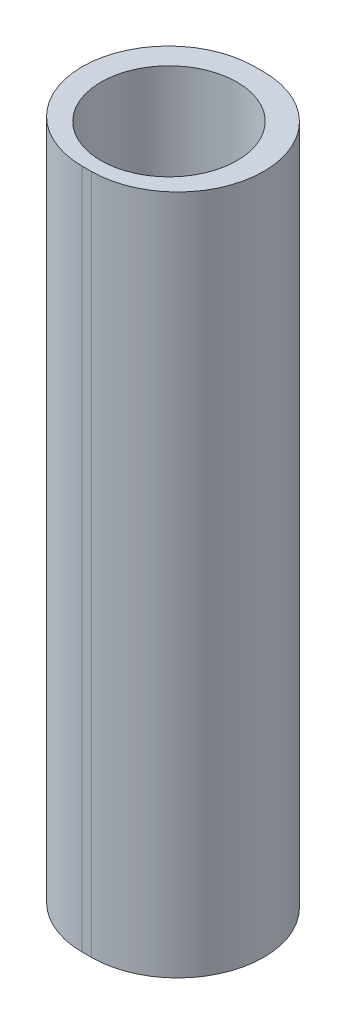
ISO-10303-21;
HEADER;
FILE_DESCRIPTION(('STEP AP214'),'2;1');
FILE_NAME('part.step','',(''),(''),'','','');
FILE_SCHEMA(('AUTOMOTIVE_DESIGN { 1 0 10303 214 1 1 1 1 }'));
ENDSEC;
DATA;
#1=APPLICATION_CONTEXT('core data for automotive mechanical design processes');
#2=APPLICATION_PROTOCOL_DEFINITION('international standard','automotive_design',2000,#1);
#3=PRODUCT_CONTEXT('',#1,'mechanical');
#4=PRODUCT('Part','Part','',(#3));
#5=PRODUCT_RELATED_PRODUCT_CATEGORY('part','',(#4));
#6=PRODUCT_DEFINITION_FORMATION('','',#4);
#7=PRODUCT_DEFINITION_CONTEXT('part definition',#1,'design');
#8=PRODUCT_DEFINITION('design','',#6,#7);
#9=PRODUCT_DEFINITION_SHAPE('','',#8);
#10=(LENGTH_UNIT() NAMED_UNIT(*) SI_UNIT(.MILLI.,.METRE.));
#11=(NAMED_UNIT(*) PLANE_ANGLE_UNIT() SI_UNIT($,.RADIAN.));
#12=(NAMED_UNIT(*) SI_UNIT($,.STERADIAN.) SOLID_ANGLE_UNIT());
#13=UNCERTAINTY_MEASURE_WITH_UNIT(LENGTH_MEASURE(1.E-05),#10,'distance_accuracy_value','');
#14=(GEOMETRIC_REPRESENTATION_CONTEXT(3) GLOBAL_UNCERTAINTY_ASSIGNED_CONTEXT((#13)) GLOBAL_UNIT_ASSIGNED_CONTEXT((#10,
#11,#12)) REPRESENTATION_CONTEXT('',''));
#15=CARTESIAN_POINT('',(0.,0.,0.));
#16=DIRECTION('',(0.,0.,1.));
#17=DIRECTION('',(1.,0.,0.));
#18=AXIS2_PLACEMENT_3D('',#15,#16,#17);
#19=CARTESIAN_POINT('',(-0.1,15.,-1.9));
#20=DIRECTION('',(0.,-1.,0.));
#21=DIRECTION('',(0.,0.,-1.));
#22=AXIS2_PLACEMENT_3D('',#19,#20,#21);
#23=CYLINDRICAL_SURFACE('',#22,1.9);
#24=DIRECTION('',(0.,-1.,0.));
#25=VECTOR('',#24,1.);
#26=CARTESIAN_POINT('',(-0.1,0.,0.));
#27=LINE('',#26,#25);
#28=CARTESIAN_POINT('',(-0.1,15.,0.));
#29=VERTEX_POINT('',#28);
#30=CARTESIAN_POINT('',(-0.1,0.,0.));
#31=VERTEX_POINT('',#30);
#32=EDGE_CURVE('E102',#29,#31,#27,.T.);
#33=ORIENTED_EDGE('',*,*,#32,.F.);
#34=CARTESIAN_POINT('',(-0.1,15.,-1.9));
#35=DIRECTION('',(0.,-1.,0.));
#36=DIRECTION('',(0.,0.,-1.));
#37=AXIS2_PLACEMENT_3D('',#34,#35,#36);
#38=CIRCLE('',#37,1.9);
#39=CARTESIAN_POINT('',(-0.1,15.,-3.8));
#40=VERTEX_POINT('',#39);
#41=EDGE_CURVE('E50',#40,#29,#38,.F.);
#42=ORIENTED_EDGE('',*,*,#41,.F.);
#43=DIRECTION('',(0.,-1.,0.));
#44=VECTOR('',#43,1.);
#45=CARTESIAN_POINT('',(-0.1,0.,-3.8));
#46=LINE('',#45,#44);
#47=CARTESIAN_POINT('',(-0.1,0.,-3.8));
#48=VERTEX_POINT('',#47);
#49=EDGE_CURVE('E116',#48,#40,#46,.F.);
#50=ORIENTED_EDGE('',*,*,#49,.F.);
#51=CARTESIAN_POINT('',(-0.1,0.,-1.9));
#52=DIRECTION('',(0.,1.,0.));
#53=DIRECTION('',(0.,0.,1.));
#54=AXIS2_PLACEMENT_3D('',#51,#52,#53);
#55=CIRCLE('',#54,1.9);
#56=EDGE_CURVE('E11',#31,#48,#55,.F.);
#57=ORIENTED_EDGE('',*,*,#56,.F.);
#58=EDGE_LOOP('',(#33,#42,#50,#57));
#59=FACE_BOUND('',#58,.T.);
#60=ADVANCED_FACE('F41',(#59),#23,.T.);
#61=CARTESIAN_POINT('',(0.1,0.,-1.9));
#62=DIRECTION('',(0.,-1.,0.));
#63=DIRECTION('',(0.,0.,-1.));
#64=AXIS2_PLACEMENT_3D('',#61,#62,#63);
#65=CYLINDRICAL_SURFACE('',#64,1.9);
#66=DIRECTION('',(0.,-1.,0.));
#67=VECTOR('',#66,1.);
#68=CARTESIAN_POINT('',(0.1,0.,0.));
#69=LINE('',#68,#67);
#70=CARTESIAN_POINT('',(0.1,0.,0.));
#71=VERTEX_POINT('',#70);
#72=CARTESIAN_POINT('',(0.1,15.,0.));
#73=VERTEX_POINT('',#72);
#74=EDGE_CURVE('E93',#71,#73,#69,.F.);
#75=ORIENTED_EDGE('',*,*,#74,.F.);
#76=CARTESIAN_POINT('',(0.1,0.,-1.9));
#77=DIRECTION('',(0.,1.,0.));
#78=DIRECTION('',(0.,0.,1.));
#79=AXIS2_PLACEMENT_3D('',#76,#77,#78);
#80=CIRCLE('',#79,1.9);
#81=CARTESIAN_POINT('',(0.1,0.,-3.8));
#82=VERTEX_POINT('',#81);
#83=EDGE_CURVE('E78',#82,#71,#80,.F.);
#84=ORIENTED_EDGE('',*,*,#83,.F.);
#85=DIRECTION('',(0.,-1.,0.));
#86=VECTOR('',#85,1.);
#87=CARTESIAN_POINT('',(0.1,0.,-3.8));
#88=LINE('',#87,#86);
#89=CARTESIAN_POINT('',(0.1,15.,-3.8));
#90=VERTEX_POINT('',#89);
#91=EDGE_CURVE('E90',#90,#82,#88,.T.);
#92=ORIENTED_EDGE('',*,*,#91,.F.);
#93=CARTESIAN_POINT('',(0.1,15.,-1.9));
#94=DIRECTION('',(0.,-1.,0.));
#95=DIRECTION('',(0.,0.,-1.));
#96=AXIS2_PLACEMENT_3D('',#93,#94,#95);
#97=CIRCLE('',#96,1.9);
#98=EDGE_CURVE('E89',#73,#90,#97,.F.);
#99=ORIENTED_EDGE('',*,*,#98,.F.);
#100=EDGE_LOOP('',(#75,#84,#92,#99));
#101=FACE_BOUND('',#100,.T.);
#102=ADVANCED_FACE('F94',(#101),#65,.T.);
#103=CARTESIAN_POINT('',(2.,0.,0.));
#104=DIRECTION('',(0.,0.,-1.));
#105=DIRECTION('',(-1.,0.,0.));
#106=AXIS2_PLACEMENT_3D('',#103,#104,#105);
#107=PLANE('',#106);
#108=DIRECTION('',(-1.,0.,0.));
#109=VECTOR('',#108,1.);
#110=CARTESIAN_POINT('',(2.,15.,0.));
#111=LINE('',#110,#109);
#112=EDGE_CURVE('E122',#73,#29,#111,.T.);
#113=ORIENTED_EDGE('',*,*,#112,.T.);
#114=ORIENTED_EDGE('',*,*,#32,.T.);
#115=DIRECTION('',(-1.,0.,0.));
#116=VECTOR('',#115,1.);
#117=CARTESIAN_POINT('',(2.,0.,0.));
#118=LINE('',#117,#116);
#119=EDGE_CURVE('E82',#71,#31,#118,.T.);
#120=ORIENTED_EDGE('',*,*,#119,.F.);
#121=ORIENTED_EDGE('',*,*,#74,.T.);
#122=EDGE_LOOP('',(#113,#114,#120,#121));
#123=FACE_BOUND('',#122,.T.);
#124=ADVANCED_FACE('F101',(#123),#107,.F.);
#125=CARTESIAN_POINT('',(2.,0.,0.));
#126=DIRECTION('',(0.,1.,0.));
#127=DIRECTION('',(0.,0.,1.));
#128=AXIS2_PLACEMENT_3D('',#125,#126,#127);
#129=PLANE('',#128);
#130=CARTESIAN_POINT('',(0.,0.,-1.81131855309213));
#131=DIRECTION('',(0.,-1.,0.));
#132=DIRECTION('',(0.,0.,-1.));
#133=AXIS2_PLACEMENT_3D('',#130,#131,#132);
#134=CIRCLE('',#133,1.5);
#135=CARTESIAN_POINT('',(0.,0.,-3.31131855309213));
#136=VERTEX_POINT('',#135);
#137=EDGE_CURVE('E130',#136,#136,#134,.T.);
#138=ORIENTED_EDGE('',*,*,#137,.F.);
#139=EDGE_LOOP('',(#138));
#140=FACE_BOUND('',#139,.T.);
#141=ORIENTED_EDGE('',*,*,#119,.T.);
#142=ORIENTED_EDGE('',*,*,#56,.T.);
#143=DIRECTION('',(-1.,0.,0.));
#144=VECTOR('',#143,1.);
#145=CARTESIAN_POINT('',(2.,0.,-3.8));
#146=LINE('',#145,#144);
#147=EDGE_CURVE('E84',#82,#48,#146,.T.);
#148=ORIENTED_EDGE('',*,*,#147,.F.);
#149=ORIENTED_EDGE('',*,*,#83,.T.);
#150=EDGE_LOOP('',(#141,#142,#148,#149));
#151=FACE_BOUND('',#150,.T.);
#152=ADVANCED_FACE('F80',(#140,#151),#129,.F.);
#153=CARTESIAN_POINT('',(2.,0.,-3.8));
#154=DIRECTION('',(0.,0.,1.));
#155=DIRECTION('',(1.,0.,0.));
#156=AXIS2_PLACEMENT_3D('',#153,#154,#155);
#157=PLANE('',#156);
#158=ORIENTED_EDGE('',*,*,#147,.T.);
#159=ORIENTED_EDGE('',*,*,#49,.T.);
#160=DIRECTION('',(-1.,0.,0.));
#161=VECTOR('',#160,1.);
#162=CARTESIAN_POINT('',(2.,15.,-3.8));
#163=LINE('',#162,#161);
#164=EDGE_CURVE('E106',#90,#40,#163,.T.);
#165=ORIENTED_EDGE('',*,*,#164,.F.);
#166=ORIENTED_EDGE('',*,*,#91,.T.);
#167=EDGE_LOOP('',(#158,#159,#165,#166));
#168=FACE_BOUND('',#167,.T.);
#169=ADVANCED_FACE('F140',(#168),#157,.F.);
#170=CARTESIAN_POINT('',(2.,15.,0.));
#171=DIRECTION('',(0.,-1.,0.));
#172=DIRECTION('',(0.,0.,-1.));
#173=AXIS2_PLACEMENT_3D('',#170,#171,#172);
#174=PLANE('',#173);
#175=CARTESIAN_POINT('',(0.,15.,-1.81131855309213));
#176=DIRECTION('',(0.,-1.,0.));
#177=DIRECTION('',(0.,0.,-1.));
#178=AXIS2_PLACEMENT_3D('',#175,#176,#177);
#179=CIRCLE('',#178,1.5);
#180=CARTESIAN_POINT('',(0.,15.,-3.31131855309213));
#181=VERTEX_POINT('',#180);
#182=EDGE_CURVE('E125',#181,#181,#179,.T.);
#183=ORIENTED_EDGE('',*,*,#182,.T.);
#184=EDGE_LOOP('',(#183));
#185=FACE_BOUND('',#184,.T.);
#186=ORIENTED_EDGE('',*,*,#164,.T.);
#187=ORIENTED_EDGE('',*,*,#41,.T.);
#188=ORIENTED_EDGE('',*,*,#112,.F.);
#189=ORIENTED_EDGE('',*,*,#98,.T.);
#190=EDGE_LOOP('',(#186,#187,#188,#189));
#191=FACE_BOUND('',#190,.T.);
#192=ADVANCED_FACE('F121',(#185,#191),#174,.F.);
#193=CARTESIAN_POINT('',(0.,15.,-1.81131855309213));
#194=DIRECTION('',(0.,-1.,0.));
#195=DIRECTION('',(0.,0.,-1.));
#196=AXIS2_PLACEMENT_3D('',#193,#194,#195);
#197=CYLINDRICAL_SURFACE('',#196,1.5);
#198=ORIENTED_EDGE('',*,*,#182,.F.);
#199=EDGE_LOOP('',(#198));
#200=FACE_BOUND('',#199,.T.);
#201=ORIENTED_EDGE('',*,*,#137,.T.);
#202=EDGE_LOOP('',(#201));
#203=FACE_BOUND('',#202,.T.);
#204=ADVANCED_FACE('F137',(#200,#203),#197,.F.);
#205=CLOSED_SHELL('',(#60,#102,#124,#152,#169,#192,#204));
#206=MANIFOLD_SOLID_BREP('B2',#205);
#207=ADVANCED_BREP_SHAPE_REPRESENTATION('',(#18,#206),#14);
#208=SHAPE_DEFINITION_REPRESENTATION(#9,#207);
ENDSEC;
END-ISO-10303-21;
